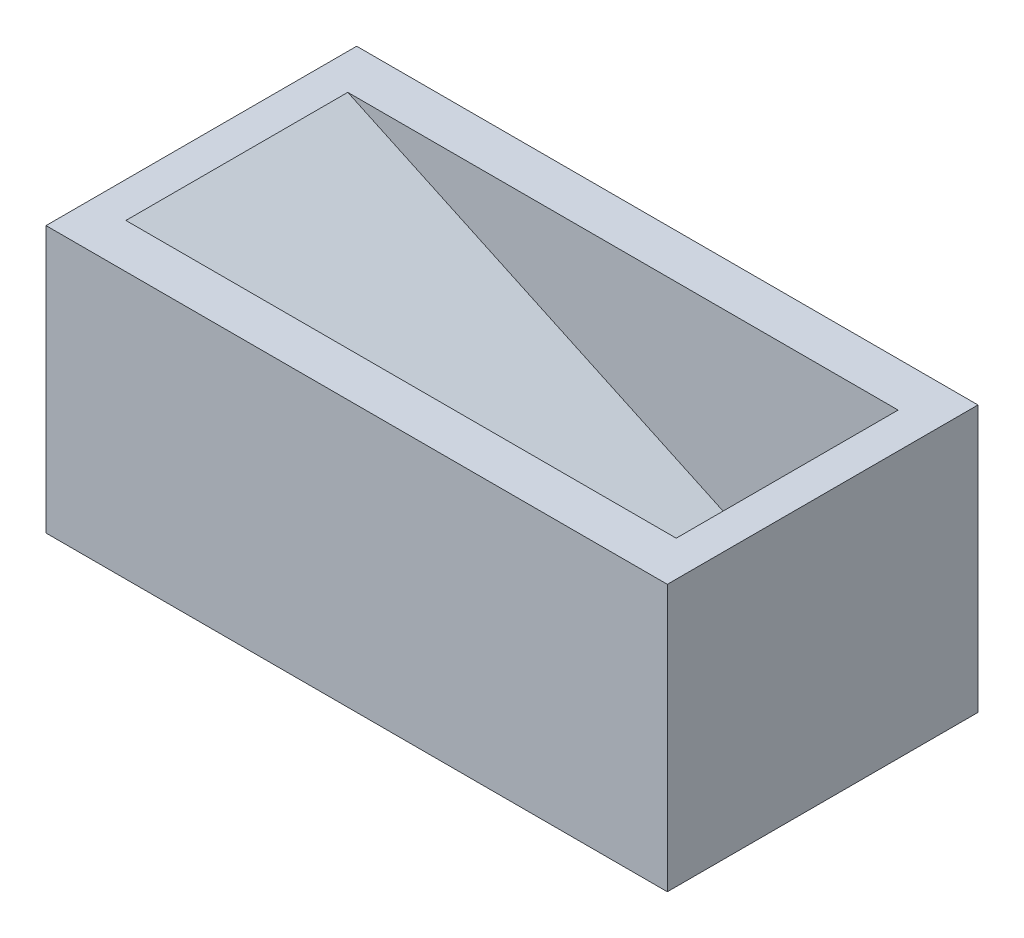
ISO-10303-21;
HEADER;
FILE_DESCRIPTION(('STEP AP214'),'2;1');
FILE_NAME('part.step','',(''),(''),'','','');
FILE_SCHEMA(('AUTOMOTIVE_DESIGN { 1 0 10303 214 1 1 1 1 }'));
ENDSEC;
DATA;
#1=APPLICATION_CONTEXT('core data for automotive mechanical design processes');
#2=APPLICATION_PROTOCOL_DEFINITION('international standard','automotive_design',2000,#1);
#3=PRODUCT_CONTEXT('',#1,'mechanical');
#4=PRODUCT('Part','Part','',(#3));
#5=PRODUCT_RELATED_PRODUCT_CATEGORY('part','',(#4));
#6=PRODUCT_DEFINITION_FORMATION('','',#4);
#7=PRODUCT_DEFINITION_CONTEXT('part definition',#1,'design');
#8=PRODUCT_DEFINITION('design','',#6,#7);
#9=PRODUCT_DEFINITION_SHAPE('','',#8);
#10=(LENGTH_UNIT() NAMED_UNIT(*) SI_UNIT(.MILLI.,.METRE.));
#11=(NAMED_UNIT(*) PLANE_ANGLE_UNIT() SI_UNIT($,.RADIAN.));
#12=(NAMED_UNIT(*) SI_UNIT($,.STERADIAN.) SOLID_ANGLE_UNIT());
#13=UNCERTAINTY_MEASURE_WITH_UNIT(LENGTH_MEASURE(1.E-05),#10,'distance_accuracy_value','');
#14=(GEOMETRIC_REPRESENTATION_CONTEXT(3) GLOBAL_UNCERTAINTY_ASSIGNED_CONTEXT((#13)) GLOBAL_UNIT_ASSIGNED_CONTEXT((#10,
#11,#12)) REPRESENTATION_CONTEXT('',''));
#15=CARTESIAN_POINT('',(0.,0.,0.));
#16=DIRECTION('',(0.,0.,1.));
#17=DIRECTION('',(1.,0.,0.));
#18=AXIS2_PLACEMENT_3D('',#15,#16,#17);
#19=CARTESIAN_POINT('',(0.,7.5,0.));
#20=DIRECTION('',(0.,1.,0.));
#21=DIRECTION('',(0.,0.,1.));
#22=AXIS2_PLACEMENT_3D('',#19,#20,#21);
#23=PLANE('',#22);
#24=DIRECTION('',(0.,0.,1.));
#25=VECTOR('',#24,1.);
#26=CARTESIAN_POINT('',(-17.5,7.5,-8.75));
#27=LINE('',#26,#25);
#28=CARTESIAN_POINT('',(-17.5,7.5,-8.75));
#29=VERTEX_POINT('',#28);
#30=CARTESIAN_POINT('',(-17.5,7.5,8.75));
#31=VERTEX_POINT('',#30);
#32=EDGE_CURVE('E126',#29,#31,#27,.T.);
#33=ORIENTED_EDGE('',*,*,#32,.T.);
#34=DIRECTION('',(1.,0.,0.));
#35=VECTOR('',#34,1.);
#36=CARTESIAN_POINT('',(-17.5,7.5,8.75));
#37=LINE('',#36,#35);
#38=CARTESIAN_POINT('',(17.5,7.5,8.75));
#39=VERTEX_POINT('',#38);
#40=EDGE_CURVE('E83',#31,#39,#37,.T.);
#41=ORIENTED_EDGE('',*,*,#40,.T.);
#42=DIRECTION('',(0.,0.,1.));
#43=VECTOR('',#42,1.);
#44=CARTESIAN_POINT('',(17.5,7.5,-8.75));
#45=LINE('',#44,#43);
#46=CARTESIAN_POINT('',(17.5,7.5,-8.75));
#47=VERTEX_POINT('',#46);
#48=EDGE_CURVE('E130',#47,#39,#45,.T.);
#49=ORIENTED_EDGE('',*,*,#48,.F.);
#50=DIRECTION('',(1.,0.,0.));
#51=VECTOR('',#50,1.);
#52=CARTESIAN_POINT('',(-17.5,7.5,-8.75));
#53=LINE('',#52,#51);
#54=EDGE_CURVE('E133',#29,#47,#53,.T.);
#55=ORIENTED_EDGE('',*,*,#54,.F.);
#56=EDGE_LOOP('',(#33,#41,#49,#55));
#57=FACE_BOUND('',#56,.T.);
#58=DIRECTION('',(0.,0.,1.));
#59=VECTOR('',#58,1.);
#60=CARTESIAN_POINT('',(-15.5,7.5,-6.25));
#61=LINE('',#60,#59);
#62=CARTESIAN_POINT('',(-15.5,7.5,-6.25));
#63=VERTEX_POINT('',#62);
#64=CARTESIAN_POINT('',(-15.5,7.5,6.25));
#65=VERTEX_POINT('',#64);
#66=EDGE_CURVE('E104',#63,#65,#61,.T.);
#67=ORIENTED_EDGE('',*,*,#66,.F.);
#68=DIRECTION('',(-1.,0.,0.));
#69=VECTOR('',#68,1.);
#70=CARTESIAN_POINT('',(-15.5,7.5,-6.25));
#71=LINE('',#70,#69);
#72=CARTESIAN_POINT('',(15.5,7.5,-6.25));
#73=VERTEX_POINT('',#72);
#74=EDGE_CURVE('E111',#73,#63,#71,.T.);
#75=ORIENTED_EDGE('',*,*,#74,.F.);
#76=DIRECTION('',(0.,0.,1.));
#77=VECTOR('',#76,1.);
#78=CARTESIAN_POINT('',(15.5,7.5,-6.25));
#79=LINE('',#78,#77);
#80=CARTESIAN_POINT('',(15.5,7.5,6.25));
#81=VERTEX_POINT('',#80);
#82=EDGE_CURVE('E121',#73,#81,#79,.T.);
#83=ORIENTED_EDGE('',*,*,#82,.T.);
#84=DIRECTION('',(-1.,0.,0.));
#85=VECTOR('',#84,1.);
#86=CARTESIAN_POINT('',(-15.5,7.5,6.25));
#87=LINE('',#86,#85);
#88=EDGE_CURVE('E119',#81,#65,#87,.T.);
#89=ORIENTED_EDGE('',*,*,#88,.T.);
#90=EDGE_LOOP('',(#67,#75,#83,#89));
#91=FACE_BOUND('',#90,.T.);
#92=ADVANCED_FACE('F33',(#57,#91),#23,.T.);
#93=CARTESIAN_POINT('',(-17.5,7.5,-8.75));
#94=DIRECTION('',(1.,0.,0.));
#95=DIRECTION('',(0.,0.,-1.));
#96=AXIS2_PLACEMENT_3D('',#93,#94,#95);
#97=PLANE('',#96);
#98=DIRECTION('',(0.,0.,1.));
#99=VECTOR('',#98,1.);
#100=CARTESIAN_POINT('',(-17.5,-7.5,-8.75));
#101=LINE('',#100,#99);
#102=CARTESIAN_POINT('',(-17.5,-7.5,-8.75));
#103=VERTEX_POINT('',#102);
#104=CARTESIAN_POINT('',(-17.5,-7.5,8.75));
#105=VERTEX_POINT('',#104);
#106=EDGE_CURVE('E135',#103,#105,#101,.T.);
#107=ORIENTED_EDGE('',*,*,#106,.T.);
#108=DIRECTION('',(0.,-1.,0.));
#109=VECTOR('',#108,1.);
#110=CARTESIAN_POINT('',(-17.5,7.5,8.75));
#111=LINE('',#110,#109);
#112=EDGE_CURVE('E11',#31,#105,#111,.T.);
#113=ORIENTED_EDGE('',*,*,#112,.F.);
#114=ORIENTED_EDGE('',*,*,#32,.F.);
#115=DIRECTION('',(0.,-1.,0.));
#116=VECTOR('',#115,1.);
#117=CARTESIAN_POINT('',(-17.5,7.5,-8.75));
#118=LINE('',#117,#116);
#119=EDGE_CURVE('E57',#29,#103,#118,.T.);
#120=ORIENTED_EDGE('',*,*,#119,.T.);
#121=EDGE_LOOP('',(#107,#113,#114,#120));
#122=FACE_BOUND('',#121,.T.);
#123=ADVANCED_FACE('F35',(#122),#97,.F.);
#124=CARTESIAN_POINT('',(-17.5,7.5,8.75));
#125=DIRECTION('',(0.,0.,-1.));
#126=DIRECTION('',(-1.,0.,0.));
#127=AXIS2_PLACEMENT_3D('',#124,#125,#126);
#128=PLANE('',#127);
#129=DIRECTION('',(1.,0.,0.));
#130=VECTOR('',#129,1.);
#131=CARTESIAN_POINT('',(-17.5,-7.5,8.75));
#132=LINE('',#131,#130);
#133=CARTESIAN_POINT('',(17.5,-7.5,8.75));
#134=VERTEX_POINT('',#133);
#135=EDGE_CURVE('E137',#105,#134,#132,.T.);
#136=ORIENTED_EDGE('',*,*,#135,.T.);
#137=DIRECTION('',(0.,-1.,0.));
#138=VECTOR('',#137,1.);
#139=CARTESIAN_POINT('',(17.5,7.5,8.75));
#140=LINE('',#139,#138);
#141=EDGE_CURVE('E41',#39,#134,#140,.T.);
#142=ORIENTED_EDGE('',*,*,#141,.F.);
#143=ORIENTED_EDGE('',*,*,#40,.F.);
#144=ORIENTED_EDGE('',*,*,#112,.T.);
#145=EDGE_LOOP('',(#136,#142,#143,#144));
#146=FACE_BOUND('',#145,.T.);
#147=ADVANCED_FACE('F151',(#146),#128,.F.);
#148=CARTESIAN_POINT('',(17.5,7.5,-8.75));
#149=DIRECTION('',(1.,0.,0.));
#150=DIRECTION('',(0.,0.,-1.));
#151=AXIS2_PLACEMENT_3D('',#148,#149,#150);
#152=PLANE('',#151);
#153=DIRECTION('',(0.,0.,1.));
#154=VECTOR('',#153,1.);
#155=CARTESIAN_POINT('',(17.5,-7.5,-8.75));
#156=LINE('',#155,#154);
#157=CARTESIAN_POINT('',(17.5,-7.5,-8.75));
#158=VERTEX_POINT('',#157);
#159=EDGE_CURVE('E140',#158,#134,#156,.T.);
#160=ORIENTED_EDGE('',*,*,#159,.F.);
#161=DIRECTION('',(0.,-1.,0.));
#162=VECTOR('',#161,1.);
#163=CARTESIAN_POINT('',(17.5,7.5,-8.75));
#164=LINE('',#163,#162);
#165=EDGE_CURVE('E146',#47,#158,#164,.T.);
#166=ORIENTED_EDGE('',*,*,#165,.F.);
#167=ORIENTED_EDGE('',*,*,#48,.T.);
#168=ORIENTED_EDGE('',*,*,#141,.T.);
#169=EDGE_LOOP('',(#160,#166,#167,#168));
#170=FACE_BOUND('',#169,.T.);
#171=ADVANCED_FACE('F149',(#170),#152,.T.);
#172=CARTESIAN_POINT('',(-17.5,7.5,-8.75));
#173=DIRECTION('',(0.,0.,-1.));
#174=DIRECTION('',(-1.,0.,0.));
#175=AXIS2_PLACEMENT_3D('',#172,#173,#174);
#176=PLANE('',#175);
#177=DIRECTION('',(1.,0.,0.));
#178=VECTOR('',#177,1.);
#179=CARTESIAN_POINT('',(-17.5,-7.5,-8.75));
#180=LINE('',#179,#178);
#181=EDGE_CURVE('E128',#103,#158,#180,.T.);
#182=ORIENTED_EDGE('',*,*,#181,.F.);
#183=ORIENTED_EDGE('',*,*,#119,.F.);
#184=ORIENTED_EDGE('',*,*,#54,.T.);
#185=ORIENTED_EDGE('',*,*,#165,.T.);
#186=EDGE_LOOP('',(#182,#183,#184,#185));
#187=FACE_BOUND('',#186,.T.);
#188=ADVANCED_FACE('F155',(#187),#176,.T.);
#189=CARTESIAN_POINT('',(0.,-7.5,0.));
#190=DIRECTION('',(0.,1.,0.));
#191=DIRECTION('',(0.,0.,1.));
#192=AXIS2_PLACEMENT_3D('',#189,#190,#191);
#193=PLANE('',#192);
#194=ORIENTED_EDGE('',*,*,#106,.F.);
#195=ORIENTED_EDGE('',*,*,#181,.T.);
#196=ORIENTED_EDGE('',*,*,#159,.T.);
#197=ORIENTED_EDGE('',*,*,#135,.F.);
#198=EDGE_LOOP('',(#194,#195,#196,#197));
#199=FACE_BOUND('',#198,.T.);
#200=ADVANCED_FACE('F154',(#199),#193,.F.);
#201=CARTESIAN_POINT('',(9.96320795014151,-4.37368886834403,-6.25));
#202=DIRECTION('',(0.906307787036653,-0.422618261740694,0.));
#203=DIRECTION('',(0.422618261740694,0.906307787036653,0.));
#204=AXIS2_PLACEMENT_3D('',#201,#202,#203);
#205=PLANE('',#204);
#206=DIRECTION('',(0.422618261740694,0.906307787036653,0.));
#207=VECTOR('',#206,1.);
#208=CARTESIAN_POINT('',(9.96320795014151,-4.37368886834403,6.25));
#209=LINE('',#208,#207);
#210=CARTESIAN_POINT('',(9.96320795014151,-4.37368886834403,6.25));
#211=VERTEX_POINT('',#210);
#212=EDGE_CURVE('E117',#211,#81,#209,.T.);
#213=ORIENTED_EDGE('',*,*,#212,.T.);
#214=ORIENTED_EDGE('',*,*,#82,.F.);
#215=DIRECTION('',(0.422618261740694,0.906307787036653,0.));
#216=VECTOR('',#215,1.);
#217=CARTESIAN_POINT('',(9.96320795014151,-4.37368886834403,-6.25));
#218=LINE('',#217,#216);
#219=CARTESIAN_POINT('',(9.96320795014151,-4.37368886834403,-6.25));
#220=VERTEX_POINT('',#219);
#221=EDGE_CURVE('E110',#220,#73,#218,.T.);
#222=ORIENTED_EDGE('',*,*,#221,.F.);
#223=DIRECTION('',(0.,0.,1.));
#224=VECTOR('',#223,1.);
#225=CARTESIAN_POINT('',(9.96320795014151,-4.37368886834403,-6.25));
#226=LINE('',#225,#224);
#227=EDGE_CURVE('E106',#220,#211,#226,.T.);
#228=ORIENTED_EDGE('',*,*,#227,.T.);
#229=EDGE_LOOP('',(#213,#214,#222,#228));
#230=FACE_BOUND('',#229,.T.);
#231=ADVANCED_FACE('F171',(#230),#205,.F.);
#232=CARTESIAN_POINT('',(-15.5,7.5,-6.25));
#233=DIRECTION('',(-0.422618261740694,-0.906307787036653,0.));
#234=DIRECTION('',(0.906307787036653,-0.422618261740694,0.));
#235=AXIS2_PLACEMENT_3D('',#232,#233,#234);
#236=PLANE('',#235);
#237=DIRECTION('',(0.906307787036653,-0.422618261740694,0.));
#238=VECTOR('',#237,1.);
#239=CARTESIAN_POINT('',(-15.5,7.5,6.25));
#240=LINE('',#239,#238);
#241=EDGE_CURVE('E48',#65,#211,#240,.T.);
#242=ORIENTED_EDGE('',*,*,#241,.T.);
#243=ORIENTED_EDGE('',*,*,#227,.F.);
#244=DIRECTION('',(0.906307787036653,-0.422618261740694,0.));
#245=VECTOR('',#244,1.);
#246=CARTESIAN_POINT('',(-15.5,7.5,-6.25));
#247=LINE('',#246,#245);
#248=EDGE_CURVE('E100',#63,#220,#247,.T.);
#249=ORIENTED_EDGE('',*,*,#248,.F.);
#250=ORIENTED_EDGE('',*,*,#66,.T.);
#251=EDGE_LOOP('',(#242,#243,#249,#250));
#252=FACE_BOUND('',#251,.T.);
#253=ADVANCED_FACE('F102',(#252),#236,.F.);
#254=CARTESIAN_POINT('',(0.,0.,-6.25));
#255=DIRECTION('',(0.,0.,1.));
#256=DIRECTION('',(1.,0.,0.));
#257=AXIS2_PLACEMENT_3D('',#254,#255,#256);
#258=PLANE('',#257);
#259=ORIENTED_EDGE('',*,*,#74,.T.);
#260=ORIENTED_EDGE('',*,*,#248,.T.);
#261=ORIENTED_EDGE('',*,*,#221,.T.);
#262=EDGE_LOOP('',(#259,#260,#261));
#263=FACE_BOUND('',#262,.T.);
#264=ADVANCED_FACE('F114',(#263),#258,.T.);
#265=CARTESIAN_POINT('',(0.,0.,6.25));
#266=DIRECTION('',(0.,0.,1.));
#267=DIRECTION('',(1.,0.,0.));
#268=AXIS2_PLACEMENT_3D('',#265,#266,#267);
#269=PLANE('',#268);
#270=ORIENTED_EDGE('',*,*,#88,.F.);
#271=ORIENTED_EDGE('',*,*,#212,.F.);
#272=ORIENTED_EDGE('',*,*,#241,.F.);
#273=EDGE_LOOP('',(#270,#271,#272));
#274=FACE_BOUND('',#273,.T.);
#275=ADVANCED_FACE('F204',(#274),#269,.F.);
#276=CLOSED_SHELL('',(#92,#123,#147,#171,#188,#200,#231,#253,#264,#275));
#277=MANIFOLD_SOLID_BREP('B2',#276);
#278=ADVANCED_BREP_SHAPE_REPRESENTATION('',(#18,#277),#14);
#279=SHAPE_DEFINITION_REPRESENTATION(#9,#278);
ENDSEC;
END-ISO-10303-21;
